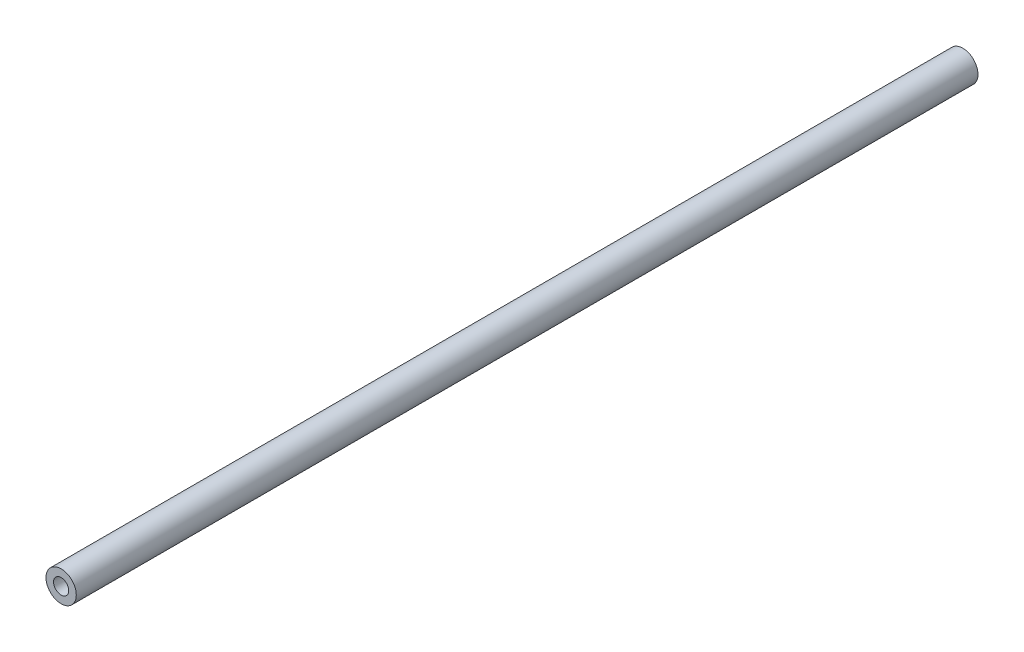
ISO-10303-21;
HEADER;
FILE_DESCRIPTION(('STEP AP214'),'2;1');
FILE_NAME('part.step','',(''),(''),'','','');
FILE_SCHEMA(('AUTOMOTIVE_DESIGN { 1 0 10303 214 1 1 1 1 }'));
ENDSEC;
DATA;
#1=APPLICATION_CONTEXT('core data for automotive mechanical design processes');
#2=APPLICATION_PROTOCOL_DEFINITION('international standard','automotive_design',2000,#1);
#3=PRODUCT_CONTEXT('',#1,'mechanical');
#4=PRODUCT('Part','Part','',(#3));
#5=PRODUCT_RELATED_PRODUCT_CATEGORY('part','',(#4));
#6=PRODUCT_DEFINITION_FORMATION('','',#4);
#7=PRODUCT_DEFINITION_CONTEXT('part definition',#1,'design');
#8=PRODUCT_DEFINITION('design','',#6,#7);
#9=PRODUCT_DEFINITION_SHAPE('','',#8);
#10=(LENGTH_UNIT() NAMED_UNIT(*) SI_UNIT(.MILLI.,.METRE.));
#11=(NAMED_UNIT(*) PLANE_ANGLE_UNIT() SI_UNIT($,.RADIAN.));
#12=(NAMED_UNIT(*) SI_UNIT($,.STERADIAN.) SOLID_ANGLE_UNIT());
#13=UNCERTAINTY_MEASURE_WITH_UNIT(LENGTH_MEASURE(1.E-05),#10,'distance_accuracy_value','');
#14=(GEOMETRIC_REPRESENTATION_CONTEXT(3) GLOBAL_UNCERTAINTY_ASSIGNED_CONTEXT((#13)) GLOBAL_UNIT_ASSIGNED_CONTEXT((#10,
#11,#12)) REPRESENTATION_CONTEXT('',''));
#15=CARTESIAN_POINT('',(0.,0.,0.));
#16=DIRECTION('',(0.,0.,1.));
#17=DIRECTION('',(1.,0.,0.));
#18=AXIS2_PLACEMENT_3D('',#15,#16,#17);
#19=CARTESIAN_POINT('',(0.,0.,119.));
#20=DIRECTION('',(0.,0.,-1.));
#21=DIRECTION('',(-1.,0.,0.));
#22=AXIS2_PLACEMENT_3D('',#19,#20,#21);
#23=CYLINDRICAL_SURFACE('',#22,2.);
#24=CARTESIAN_POINT('',(0.,0.,119.));
#25=DIRECTION('',(0.,0.,1.));
#26=DIRECTION('',(1.,0.,0.));
#27=AXIS2_PLACEMENT_3D('',#24,#25,#26);
#28=CIRCLE('',#27,2.);
#29=CARTESIAN_POINT('',(2.,0.,119.));
#30=VERTEX_POINT('',#29);
#31=EDGE_CURVE('E10',#30,#30,#28,.T.);
#32=ORIENTED_EDGE('',*,*,#31,.F.);
#33=EDGE_LOOP('',(#32));
#34=FACE_BOUND('',#33,.T.);
#35=CARTESIAN_POINT('',(0.,0.,0.));
#36=DIRECTION('',(0.,0.,1.));
#37=DIRECTION('',(1.,0.,0.));
#38=AXIS2_PLACEMENT_3D('',#35,#36,#37);
#39=CIRCLE('',#38,2.);
#40=CARTESIAN_POINT('',(2.,0.,0.));
#41=VERTEX_POINT('',#40);
#42=EDGE_CURVE('E37',#41,#41,#39,.T.);
#43=ORIENTED_EDGE('',*,*,#42,.T.);
#44=EDGE_LOOP('',(#43));
#45=FACE_BOUND('',#44,.T.);
#46=ADVANCED_FACE('F34',(#34,#45),#23,.T.);
#47=CARTESIAN_POINT('',(0.,0.,119.));
#48=DIRECTION('',(0.,0.,1.));
#49=DIRECTION('',(1.,0.,0.));
#50=AXIS2_PLACEMENT_3D('',#47,#48,#49);
#51=PLANE('',#50);
#52=CARTESIAN_POINT('',(0.,0.,119.));
#53=DIRECTION('',(0.,0.,-1.));
#54=DIRECTION('',(-1.,0.,0.));
#55=AXIS2_PLACEMENT_3D('',#52,#53,#54);
#56=CIRCLE('',#55,1.);
#57=CARTESIAN_POINT('',(-1.,0.,119.));
#58=VERTEX_POINT('',#57);
#59=EDGE_CURVE('E44',#58,#58,#56,.T.);
#60=ORIENTED_EDGE('',*,*,#59,.T.);
#61=EDGE_LOOP('',(#60));
#62=FACE_BOUND('',#61,.T.);
#63=ORIENTED_EDGE('',*,*,#31,.T.);
#64=EDGE_LOOP('',(#63));
#65=FACE_BOUND('',#64,.T.);
#66=ADVANCED_FACE('F52',(#62,#65),#51,.T.);
#67=CARTESIAN_POINT('',(0.,0.,0.));
#68=DIRECTION('',(0.,0.,1.));
#69=DIRECTION('',(1.,0.,0.));
#70=AXIS2_PLACEMENT_3D('',#67,#68,#69);
#71=PLANE('',#70);
#72=CARTESIAN_POINT('',(0.,0.,0.));
#73=DIRECTION('',(0.,0.,-1.));
#74=DIRECTION('',(-1.,0.,0.));
#75=AXIS2_PLACEMENT_3D('',#72,#73,#74);
#76=CIRCLE('',#75,1.);
#77=CARTESIAN_POINT('',(-1.,0.,0.));
#78=VERTEX_POINT('',#77);
#79=EDGE_CURVE('E46',#78,#78,#76,.T.);
#80=ORIENTED_EDGE('',*,*,#79,.F.);
#81=EDGE_LOOP('',(#80));
#82=FACE_BOUND('',#81,.T.);
#83=ORIENTED_EDGE('',*,*,#42,.F.);
#84=EDGE_LOOP('',(#83));
#85=FACE_BOUND('',#84,.T.);
#86=ADVANCED_FACE('F57',(#82,#85),#71,.F.);
#87=CARTESIAN_POINT('',(0.,0.,119.));
#88=DIRECTION('',(0.,0.,-1.));
#89=DIRECTION('',(-1.,0.,0.));
#90=AXIS2_PLACEMENT_3D('',#87,#88,#89);
#91=CYLINDRICAL_SURFACE('',#90,1.);
#92=ORIENTED_EDGE('',*,*,#59,.F.);
#93=EDGE_LOOP('',(#92));
#94=FACE_BOUND('',#93,.T.);
#95=ORIENTED_EDGE('',*,*,#79,.T.);
#96=EDGE_LOOP('',(#95));
#97=FACE_BOUND('',#96,.T.);
#98=ADVANCED_FACE('F54',(#94,#97),#91,.F.);
#99=CLOSED_SHELL('',(#46,#66,#86,#98));
#100=MANIFOLD_SOLID_BREP('B2',#99);
#101=ADVANCED_BREP_SHAPE_REPRESENTATION('',(#18,#100),#14);
#102=SHAPE_DEFINITION_REPRESENTATION(#9,#101);
ENDSEC;
END-ISO-10303-21;
